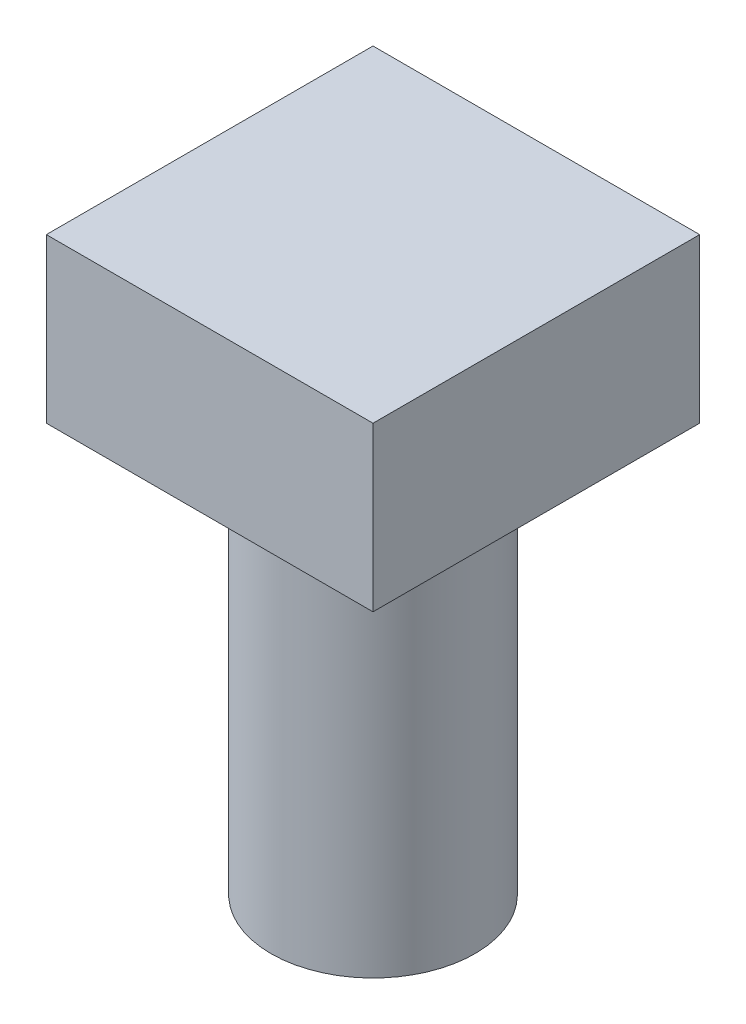
ISO-10303-21;
HEADER;
FILE_DESCRIPTION(('STEP AP214'),'2;1');
FILE_NAME('part.step','',(''),(''),'','','');
FILE_SCHEMA(('AUTOMOTIVE_DESIGN { 1 0 10303 214 1 1 1 1 }'));
ENDSEC;
DATA;
#1=APPLICATION_CONTEXT('core data for automotive mechanical design processes');
#2=APPLICATION_PROTOCOL_DEFINITION('international standard','automotive_design',2000,#1);
#3=PRODUCT_CONTEXT('',#1,'mechanical');
#4=PRODUCT('Part','Part','',(#3));
#5=PRODUCT_RELATED_PRODUCT_CATEGORY('part','',(#4));
#6=PRODUCT_DEFINITION_FORMATION('','',#4);
#7=PRODUCT_DEFINITION_CONTEXT('part definition',#1,'design');
#8=PRODUCT_DEFINITION('design','',#6,#7);
#9=PRODUCT_DEFINITION_SHAPE('','',#8);
#10=(LENGTH_UNIT() NAMED_UNIT(*) SI_UNIT(.MILLI.,.METRE.));
#11=(NAMED_UNIT(*) PLANE_ANGLE_UNIT() SI_UNIT($,.RADIAN.));
#12=(NAMED_UNIT(*) SI_UNIT($,.STERADIAN.) SOLID_ANGLE_UNIT());
#13=UNCERTAINTY_MEASURE_WITH_UNIT(LENGTH_MEASURE(1.E-05),#10,'distance_accuracy_value','');
#14=(GEOMETRIC_REPRESENTATION_CONTEXT(3) GLOBAL_UNCERTAINTY_ASSIGNED_CONTEXT((#13)) GLOBAL_UNIT_ASSIGNED_CONTEXT((#10,
#11,#12)) REPRESENTATION_CONTEXT('',''));
#15=CARTESIAN_POINT('',(0.,0.,0.));
#16=DIRECTION('',(0.,0.,1.));
#17=DIRECTION('',(1.,0.,0.));
#18=AXIS2_PLACEMENT_3D('',#15,#16,#17);
#19=CARTESIAN_POINT('',(0.,12.7,0.));
#20=DIRECTION('',(0.,-1.,0.));
#21=DIRECTION('',(0.,0.,-1.));
#22=AXIS2_PLACEMENT_3D('',#19,#20,#21);
#23=CYLINDRICAL_SURFACE('',#22,3.175);
#24=CARTESIAN_POINT('',(0.,12.7,0.));
#25=DIRECTION('',(0.,1.,0.));
#26=DIRECTION('',(0.,0.,1.));
#27=AXIS2_PLACEMENT_3D('',#24,#25,#26);
#28=CIRCLE('',#27,3.175);
#29=CARTESIAN_POINT('',(0.,12.7,3.175));
#30=VERTEX_POINT('',#29);
#31=EDGE_CURVE('E11',#30,#30,#28,.T.);
#32=ORIENTED_EDGE('',*,*,#31,.F.);
#33=EDGE_LOOP('',(#32));
#34=FACE_BOUND('',#33,.T.);
#35=CARTESIAN_POINT('',(0.,0.,0.));
#36=DIRECTION('',(0.,1.,0.));
#37=DIRECTION('',(0.,0.,1.));
#38=AXIS2_PLACEMENT_3D('',#35,#36,#37);
#39=CIRCLE('',#38,3.175);
#40=CARTESIAN_POINT('',(0.,0.,3.175));
#41=VERTEX_POINT('',#40);
#42=EDGE_CURVE('E42',#41,#41,#39,.T.);
#43=ORIENTED_EDGE('',*,*,#42,.T.);
#44=EDGE_LOOP('',(#43));
#45=FACE_BOUND('',#44,.T.);
#46=ADVANCED_FACE('F39',(#34,#45),#23,.T.);
#47=CARTESIAN_POINT('',(0.,0.,0.));
#48=DIRECTION('',(0.,1.,0.));
#49=DIRECTION('',(0.,0.,1.));
#50=AXIS2_PLACEMENT_3D('',#47,#48,#49);
#51=PLANE('',#50);
#52=ORIENTED_EDGE('',*,*,#42,.F.);
#53=EDGE_LOOP('',(#52));
#54=FACE_BOUND('',#53,.T.);
#55=ADVANCED_FACE('F118',(#54),#51,.F.);
#56=CARTESIAN_POINT('',(5.08,17.78,5.08));
#57=DIRECTION('',(-1.,0.,0.));
#58=DIRECTION('',(0.,0.,1.));
#59=AXIS2_PLACEMENT_3D('',#56,#57,#58);
#60=PLANE('',#59);
#61=DIRECTION('',(0.,0.,-1.));
#62=VECTOR('',#61,1.);
#63=CARTESIAN_POINT('',(5.08,12.7,5.08));
#64=LINE('',#63,#62);
#65=CARTESIAN_POINT('',(5.08,12.7,5.08));
#66=VERTEX_POINT('',#65);
#67=CARTESIAN_POINT('',(5.08,12.7,-5.08));
#68=VERTEX_POINT('',#67);
#69=EDGE_CURVE('E106',#66,#68,#64,.T.);
#70=ORIENTED_EDGE('',*,*,#69,.T.);
#71=DIRECTION('',(0.,-1.,0.));
#72=VECTOR('',#71,1.);
#73=CARTESIAN_POINT('',(5.08,17.78,-5.08));
#74=LINE('',#73,#72);
#75=CARTESIAN_POINT('',(5.08,17.78,-5.08));
#76=VERTEX_POINT('',#75);
#77=EDGE_CURVE('E97',#76,#68,#74,.T.);
#78=ORIENTED_EDGE('',*,*,#77,.F.);
#79=DIRECTION('',(0.,0.,-1.));
#80=VECTOR('',#79,1.);
#81=CARTESIAN_POINT('',(5.08,17.78,5.08));
#82=LINE('',#81,#80);
#83=CARTESIAN_POINT('',(5.08,17.78,5.08));
#84=VERTEX_POINT('',#83);
#85=EDGE_CURVE('E91',#84,#76,#82,.T.);
#86=ORIENTED_EDGE('',*,*,#85,.F.);
#87=DIRECTION('',(0.,-1.,0.));
#88=VECTOR('',#87,1.);
#89=CARTESIAN_POINT('',(5.08,17.78,5.08));
#90=LINE('',#89,#88);
#91=EDGE_CURVE('E102',#84,#66,#90,.T.);
#92=ORIENTED_EDGE('',*,*,#91,.T.);
#93=EDGE_LOOP('',(#70,#78,#86,#92));
#94=FACE_BOUND('',#93,.T.);
#95=ADVANCED_FACE('F120',(#94),#60,.F.);
#96=CARTESIAN_POINT('',(-5.08,17.78,-5.08));
#97=DIRECTION('',(0.,0.,1.));
#98=DIRECTION('',(1.,0.,0.));
#99=AXIS2_PLACEMENT_3D('',#96,#97,#98);
#100=PLANE('',#99);
#101=DIRECTION('',(-1.,0.,0.));
#102=VECTOR('',#101,1.);
#103=CARTESIAN_POINT('',(-5.08,12.7,-5.08));
#104=LINE('',#103,#102);
#105=CARTESIAN_POINT('',(-5.08,12.7,-5.08));
#106=VERTEX_POINT('',#105);
#107=EDGE_CURVE('E96',#68,#106,#104,.T.);
#108=ORIENTED_EDGE('',*,*,#107,.T.);
#109=DIRECTION('',(0.,-1.,0.));
#110=VECTOR('',#109,1.);
#111=CARTESIAN_POINT('',(-5.08,17.78,-5.08));
#112=LINE('',#111,#110);
#113=CARTESIAN_POINT('',(-5.08,17.78,-5.08));
#114=VERTEX_POINT('',#113);
#115=EDGE_CURVE('E94',#114,#106,#112,.T.);
#116=ORIENTED_EDGE('',*,*,#115,.F.);
#117=DIRECTION('',(-1.,0.,0.));
#118=VECTOR('',#117,1.);
#119=CARTESIAN_POINT('',(-5.08,17.78,-5.08));
#120=LINE('',#119,#118);
#121=EDGE_CURVE('E86',#76,#114,#120,.T.);
#122=ORIENTED_EDGE('',*,*,#121,.F.);
#123=ORIENTED_EDGE('',*,*,#77,.T.);
#124=EDGE_LOOP('',(#108,#116,#122,#123));
#125=FACE_BOUND('',#124,.T.);
#126=ADVANCED_FACE('F95',(#125),#100,.F.);
#127=CARTESIAN_POINT('',(-5.08,17.78,5.08));
#128=DIRECTION('',(1.,0.,0.));
#129=DIRECTION('',(0.,0.,-1.));
#130=AXIS2_PLACEMENT_3D('',#127,#128,#129);
#131=PLANE('',#130);
#132=DIRECTION('',(0.,0.,1.));
#133=VECTOR('',#132,1.);
#134=CARTESIAN_POINT('',(-5.08,12.7,5.08));
#135=LINE('',#134,#133);
#136=CARTESIAN_POINT('',(-5.08,12.7,5.08));
#137=VERTEX_POINT('',#136);
#138=EDGE_CURVE('E72',#106,#137,#135,.T.);
#139=ORIENTED_EDGE('',*,*,#138,.T.);
#140=DIRECTION('',(0.,-1.,0.));
#141=VECTOR('',#140,1.);
#142=CARTESIAN_POINT('',(-5.08,17.78,5.08));
#143=LINE('',#142,#141);
#144=CARTESIAN_POINT('',(-5.08,17.78,5.08));
#145=VERTEX_POINT('',#144);
#146=EDGE_CURVE('E98',#145,#137,#143,.T.);
#147=ORIENTED_EDGE('',*,*,#146,.F.);
#148=DIRECTION('',(0.,0.,1.));
#149=VECTOR('',#148,1.);
#150=CARTESIAN_POINT('',(-5.08,17.78,5.08));
#151=LINE('',#150,#149);
#152=EDGE_CURVE('E89',#114,#145,#151,.T.);
#153=ORIENTED_EDGE('',*,*,#152,.F.);
#154=ORIENTED_EDGE('',*,*,#115,.T.);
#155=EDGE_LOOP('',(#139,#147,#153,#154));
#156=FACE_BOUND('',#155,.T.);
#157=ADVANCED_FACE('F100',(#156),#131,.F.);
#158=CARTESIAN_POINT('',(-5.08,17.78,5.08));
#159=DIRECTION('',(0.,0.,-1.));
#160=DIRECTION('',(-1.,0.,0.));
#161=AXIS2_PLACEMENT_3D('',#158,#159,#160);
#162=PLANE('',#161);
#163=DIRECTION('',(1.,0.,0.));
#164=VECTOR('',#163,1.);
#165=CARTESIAN_POINT('',(-5.08,12.7,5.08));
#166=LINE('',#165,#164);
#167=EDGE_CURVE('E78',#137,#66,#166,.T.);
#168=ORIENTED_EDGE('',*,*,#167,.T.);
#169=ORIENTED_EDGE('',*,*,#91,.F.);
#170=DIRECTION('',(1.,0.,0.));
#171=VECTOR('',#170,1.);
#172=CARTESIAN_POINT('',(-5.08,17.78,5.08));
#173=LINE('',#172,#171);
#174=EDGE_CURVE('E55',#145,#84,#173,.T.);
#175=ORIENTED_EDGE('',*,*,#174,.F.);
#176=ORIENTED_EDGE('',*,*,#146,.T.);
#177=EDGE_LOOP('',(#168,#169,#175,#176));
#178=FACE_BOUND('',#177,.T.);
#179=ADVANCED_FACE('F133',(#178),#162,.F.);
#180=CARTESIAN_POINT('',(0.,17.78,0.));
#181=DIRECTION('',(0.,-1.,0.));
#182=DIRECTION('',(0.,0.,-1.));
#183=AXIS2_PLACEMENT_3D('',#180,#181,#182);
#184=PLANE('',#183);
#185=ORIENTED_EDGE('',*,*,#85,.T.);
#186=ORIENTED_EDGE('',*,*,#121,.T.);
#187=ORIENTED_EDGE('',*,*,#152,.T.);
#188=ORIENTED_EDGE('',*,*,#174,.T.);
#189=EDGE_LOOP('',(#185,#186,#187,#188));
#190=FACE_BOUND('',#189,.T.);
#191=ADVANCED_FACE('F87',(#190),#184,.F.);
#192=CARTESIAN_POINT('',(0.,12.7,0.));
#193=DIRECTION('',(0.,-1.,0.));
#194=DIRECTION('',(0.,0.,-1.));
#195=AXIS2_PLACEMENT_3D('',#192,#193,#194);
#196=PLANE('',#195);
#197=ORIENTED_EDGE('',*,*,#31,.T.);
#198=EDGE_LOOP('',(#197));
#199=FACE_BOUND('',#198,.T.);
#200=ORIENTED_EDGE('',*,*,#69,.F.);
#201=ORIENTED_EDGE('',*,*,#167,.F.);
#202=ORIENTED_EDGE('',*,*,#138,.F.);
#203=ORIENTED_EDGE('',*,*,#107,.F.);
#204=EDGE_LOOP('',(#200,#201,#202,#203));
#205=FACE_BOUND('',#204,.T.);
#206=ADVANCED_FACE('F136',(#199,#205),#196,.T.);
#207=CLOSED_SHELL('',(#46,#55,#95,#126,#157,#179,#191,#206));
#208=MANIFOLD_SOLID_BREP('B2',#207);
#209=ADVANCED_BREP_SHAPE_REPRESENTATION('',(#18,#208),#14);
#210=SHAPE_DEFINITION_REPRESENTATION(#9,#209);
ENDSEC;
END-ISO-10303-21;
